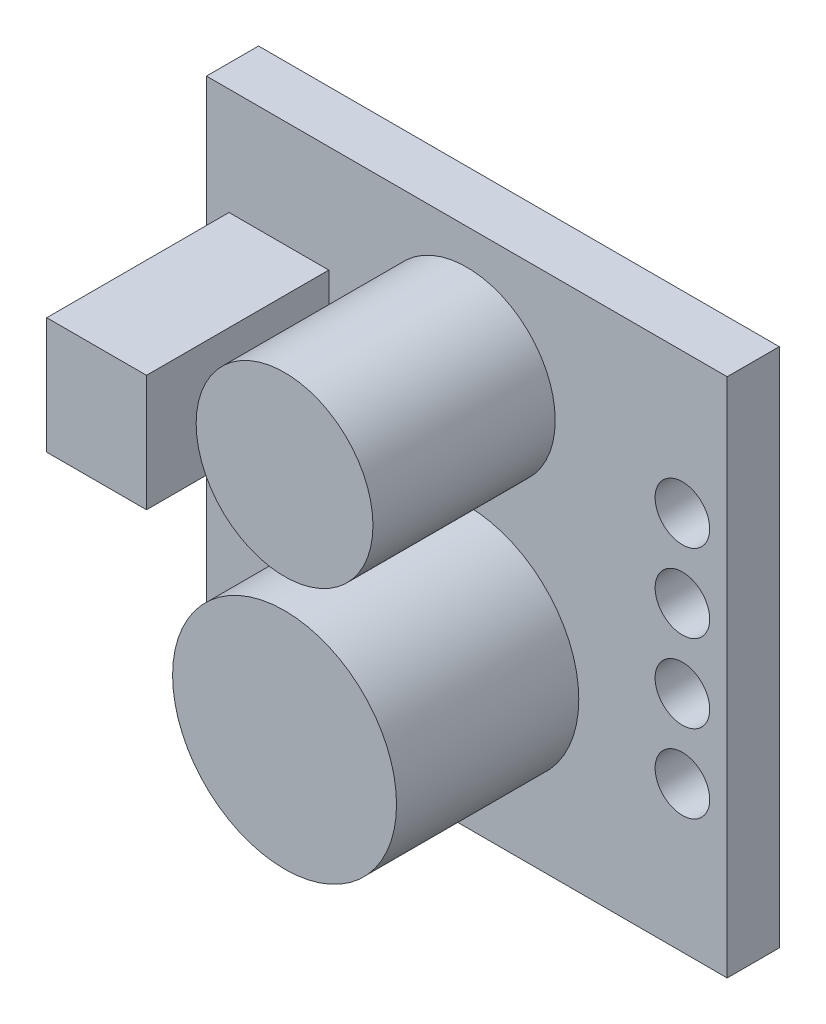
ISO-10303-21;
HEADER;
FILE_DESCRIPTION(('STEP AP214'),'2;1');
FILE_NAME('part.step','',(''),(''),'','','');
FILE_SCHEMA(('AUTOMOTIVE_DESIGN { 1 0 10303 214 1 1 1 1 }'));
ENDSEC;
DATA;
#1=APPLICATION_CONTEXT('core data for automotive mechanical design processes');
#2=APPLICATION_PROTOCOL_DEFINITION('international standard','automotive_design',2000,#1);
#3=PRODUCT_CONTEXT('',#1,'mechanical');
#4=PRODUCT('Part','Part','',(#3));
#5=PRODUCT_RELATED_PRODUCT_CATEGORY('part','',(#4));
#6=PRODUCT_DEFINITION_FORMATION('','',#4);
#7=PRODUCT_DEFINITION_CONTEXT('part definition',#1,'design');
#8=PRODUCT_DEFINITION('design','',#6,#7);
#9=PRODUCT_DEFINITION_SHAPE('','',#8);
#10=(LENGTH_UNIT() NAMED_UNIT(*) SI_UNIT(.MILLI.,.METRE.));
#11=(NAMED_UNIT(*) PLANE_ANGLE_UNIT() SI_UNIT($,.RADIAN.));
#12=(NAMED_UNIT(*) SI_UNIT($,.STERADIAN.) SOLID_ANGLE_UNIT());
#13=UNCERTAINTY_MEASURE_WITH_UNIT(LENGTH_MEASURE(1.E-05),#10,'distance_accuracy_value','');
#14=(GEOMETRIC_REPRESENTATION_CONTEXT(3) GLOBAL_UNCERTAINTY_ASSIGNED_CONTEXT((#13)) GLOBAL_UNIT_ASSIGNED_CONTEXT((#10,
#11,#12)) REPRESENTATION_CONTEXT('',''));
#15=CARTESIAN_POINT('',(0.,0.,0.));
#16=DIRECTION('',(0.,0.,1.));
#17=DIRECTION('',(1.,0.,0.));
#18=AXIS2_PLACEMENT_3D('',#15,#16,#17);
#19=CARTESIAN_POINT('',(0.,0.,2.));
#20=DIRECTION('',(0.,0.,-1.));
#21=DIRECTION('',(-1.,0.,0.));
#22=AXIS2_PLACEMENT_3D('',#19,#20,#21);
#23=PLANE('',#22);
#24=CARTESIAN_POINT('',(8.28012745863704,4.59800209335981,2.));
#25=DIRECTION('',(0.,0.,1.));
#26=DIRECTION('',(1.,0.,0.));
#27=AXIS2_PLACEMENT_3D('',#24,#25,#26);
#28=CIRCLE('',#27,1.04892016649654);
#29=CARTESIAN_POINT('',(9.32904762513358,4.59800209335981,2.));
#30=VERTEX_POINT('',#29);
#31=EDGE_CURVE('E202',#30,#30,#28,.T.);
#32=ORIENTED_EDGE('',*,*,#31,.F.);
#33=EDGE_LOOP('',(#32));
#34=FACE_BOUND('',#33,.T.);
#35=CARTESIAN_POINT('',(8.28012745863708,1.59800209335981,2.));
#36=DIRECTION('',(0.,0.,1.));
#37=DIRECTION('',(1.,0.,0.));
#38=AXIS2_PLACEMENT_3D('',#35,#36,#37);
#39=CIRCLE('',#38,1.04892016649654);
#40=CARTESIAN_POINT('',(9.32904762513361,1.59800209335981,2.));
#41=VERTEX_POINT('',#40);
#42=EDGE_CURVE('E196',#41,#41,#39,.T.);
#43=ORIENTED_EDGE('',*,*,#42,.F.);
#44=EDGE_LOOP('',(#43));
#45=FACE_BOUND('',#44,.T.);
#46=CARTESIAN_POINT('',(8.28012745863711,-1.40199790664019,2.));
#47=DIRECTION('',(0.,0.,1.));
#48=DIRECTION('',(1.,0.,0.));
#49=AXIS2_PLACEMENT_3D('',#46,#47,#48);
#50=CIRCLE('',#49,1.04892016649654);
#51=CARTESIAN_POINT('',(9.32904762513364,-1.40199790664019,2.));
#52=VERTEX_POINT('',#51);
#53=EDGE_CURVE('E190',#52,#52,#50,.T.);
#54=ORIENTED_EDGE('',*,*,#53,.F.);
#55=EDGE_LOOP('',(#54));
#56=FACE_BOUND('',#55,.T.);
#57=CARTESIAN_POINT('',(8.28012745863714,-4.40199790664019,2.));
#58=DIRECTION('',(0.,0.,1.));
#59=DIRECTION('',(1.,0.,0.));
#60=AXIS2_PLACEMENT_3D('',#57,#58,#59);
#61=CIRCLE('',#60,1.04892016649654);
#62=CARTESIAN_POINT('',(9.32904762513367,-4.40199790664019,2.));
#63=VERTEX_POINT('',#62);
#64=EDGE_CURVE('E184',#63,#63,#61,.T.);
#65=ORIENTED_EDGE('',*,*,#64,.F.);
#66=EDGE_LOOP('',(#65));
#67=FACE_BOUND('',#66,.T.);
#68=DIRECTION('',(0.,1.,0.));
#69=VECTOR('',#68,1.);
#70=CARTESIAN_POINT('',(10.,-10.,2.));
#71=LINE('',#70,#69);
#72=CARTESIAN_POINT('',(10.,-10.,2.));
#73=VERTEX_POINT('',#72);
#74=CARTESIAN_POINT('',(10.,10.,2.));
#75=VERTEX_POINT('',#74);
#76=EDGE_CURVE('E131',#73,#75,#71,.T.);
#77=ORIENTED_EDGE('',*,*,#76,.T.);
#78=DIRECTION('',(-1.,0.,0.));
#79=VECTOR('',#78,1.);
#80=CARTESIAN_POINT('',(-10.,10.,2.));
#81=LINE('',#80,#79);
#82=CARTESIAN_POINT('',(-10.,10.,2.));
#83=VERTEX_POINT('',#82);
#84=EDGE_CURVE('E134',#75,#83,#81,.T.);
#85=ORIENTED_EDGE('',*,*,#84,.T.);
#86=DIRECTION('',(0.,-1.,0.));
#87=VECTOR('',#86,1.);
#88=CARTESIAN_POINT('',(-10.,-10.,2.));
#89=LINE('',#88,#87);
#90=CARTESIAN_POINT('',(-10.,-10.,2.));
#91=VERTEX_POINT('',#90);
#92=EDGE_CURVE('E137',#83,#91,#89,.T.);
#93=ORIENTED_EDGE('',*,*,#92,.T.);
#94=DIRECTION('',(1.,0.,0.));
#95=VECTOR('',#94,1.);
#96=CARTESIAN_POINT('',(-10.,-10.,2.));
#97=LINE('',#96,#95);
#98=EDGE_CURVE('E139',#91,#73,#97,.T.);
#99=ORIENTED_EDGE('',*,*,#98,.T.);
#100=EDGE_LOOP('',(#77,#85,#93,#99));
#101=FACE_BOUND('',#100,.T.);
#102=CARTESIAN_POINT('',(0.,5.24700562003488,2.));
#103=DIRECTION('',(0.,0.,-1.));
#104=DIRECTION('',(-1.,0.,0.));
#105=AXIS2_PLACEMENT_3D('',#102,#103,#104);
#106=CIRCLE('',#105,3.39530296874813);
#107=CARTESIAN_POINT('',(-3.39530296874813,5.24700562003488,2.));
#108=VERTEX_POINT('',#107);
#109=EDGE_CURVE('E41',#108,#108,#106,.F.);
#110=ORIENTED_EDGE('',*,*,#109,.F.);
#111=EDGE_LOOP('',(#110));
#112=FACE_BOUND('',#111,.T.);
#113=CARTESIAN_POINT('',(0.,-3.57798898691897,2.));
#114=DIRECTION('',(0.,0.,-1.));
#115=DIRECTION('',(-1.,0.,0.));
#116=AXIS2_PLACEMENT_3D('',#113,#114,#115);
#117=CIRCLE('',#116,4.30062691817861);
#118=CARTESIAN_POINT('',(-4.30062691817861,-3.57798898691897,2.));
#119=VERTEX_POINT('',#118);
#120=EDGE_CURVE('E11',#119,#119,#117,.F.);
#121=ORIENTED_EDGE('',*,*,#120,.F.);
#122=EDGE_LOOP('',(#121));
#123=FACE_BOUND('',#122,.T.);
#124=DIRECTION('',(0.,1.,0.));
#125=VECTOR('',#124,1.);
#126=CARTESIAN_POINT('',(-5.30183976980148,1.42174782703819,2.));
#127=LINE('',#126,#125);
#128=CARTESIAN_POINT('',(-5.30183976980148,1.42174782703819,2.));
#129=VERTEX_POINT('',#128);
#130=CARTESIAN_POINT('',(-5.30183976980148,5.89586116117857,2.));
#131=VERTEX_POINT('',#130);
#132=EDGE_CURVE('E118',#129,#131,#127,.T.);
#133=ORIENTED_EDGE('',*,*,#132,.F.);
#134=DIRECTION('',(1.,0.,0.));
#135=VECTOR('',#134,1.);
#136=CARTESIAN_POINT('',(-9.13389711942081,1.42174782703819,2.));
#137=LINE('',#136,#135);
#138=CARTESIAN_POINT('',(-9.13389711942081,1.42174782703819,2.));
#139=VERTEX_POINT('',#138);
#140=EDGE_CURVE('E115',#139,#129,#137,.T.);
#141=ORIENTED_EDGE('',*,*,#140,.F.);
#142=DIRECTION('',(0.,-1.,0.));
#143=VECTOR('',#142,1.);
#144=CARTESIAN_POINT('',(-9.13389711942081,1.42174782703819,2.));
#145=LINE('',#144,#143);
#146=CARTESIAN_POINT('',(-9.13389711942081,5.89586116117857,2.));
#147=VERTEX_POINT('',#146);
#148=EDGE_CURVE('E53',#147,#139,#145,.T.);
#149=ORIENTED_EDGE('',*,*,#148,.F.);
#150=DIRECTION('',(-1.,0.,0.));
#151=VECTOR('',#150,1.);
#152=CARTESIAN_POINT('',(-9.13389711942081,5.89586116117857,2.));
#153=LINE('',#152,#151);
#154=EDGE_CURVE('E48',#131,#147,#153,.T.);
#155=ORIENTED_EDGE('',*,*,#154,.F.);
#156=EDGE_LOOP('',(#133,#141,#149,#155));
#157=FACE_BOUND('',#156,.T.);
#158=ADVANCED_FACE('F33',(#34,#45,#56,#67,#101,#112,#123,#157),#23,.F.);
#159=CARTESIAN_POINT('',(10.,-10.,2.));
#160=DIRECTION('',(-1.,0.,0.));
#161=DIRECTION('',(0.,0.,1.));
#162=AXIS2_PLACEMENT_3D('',#159,#160,#161);
#163=PLANE('',#162);
#164=DIRECTION('',(0.,1.,0.));
#165=VECTOR('',#164,1.);
#166=CARTESIAN_POINT('',(10.,-10.,0.));
#167=LINE('',#166,#165);
#168=CARTESIAN_POINT('',(10.,-10.,0.));
#169=VERTEX_POINT('',#168);
#170=CARTESIAN_POINT('',(10.,10.,0.));
#171=VERTEX_POINT('',#170);
#172=EDGE_CURVE('E130',#169,#171,#167,.T.);
#173=ORIENTED_EDGE('',*,*,#172,.T.);
#174=DIRECTION('',(0.,0.,-1.));
#175=VECTOR('',#174,1.);
#176=CARTESIAN_POINT('',(10.,10.,2.));
#177=LINE('',#176,#175);
#178=EDGE_CURVE('E157',#75,#171,#177,.T.);
#179=ORIENTED_EDGE('',*,*,#178,.F.);
#180=ORIENTED_EDGE('',*,*,#76,.F.);
#181=DIRECTION('',(0.,0.,-1.));
#182=VECTOR('',#181,1.);
#183=CARTESIAN_POINT('',(10.,-10.,2.));
#184=LINE('',#183,#182);
#185=EDGE_CURVE('E141',#73,#169,#184,.T.);
#186=ORIENTED_EDGE('',*,*,#185,.T.);
#187=EDGE_LOOP('',(#173,#179,#180,#186));
#188=FACE_BOUND('',#187,.T.);
#189=ADVANCED_FACE('F35',(#188),#163,.F.);
#190=CARTESIAN_POINT('',(-10.,10.,2.));
#191=DIRECTION('',(0.,-1.,0.));
#192=DIRECTION('',(0.,0.,-1.));
#193=AXIS2_PLACEMENT_3D('',#190,#191,#192);
#194=PLANE('',#193);
#195=DIRECTION('',(-1.,0.,0.));
#196=VECTOR('',#195,1.);
#197=CARTESIAN_POINT('',(-10.,10.,0.));
#198=LINE('',#197,#196);
#199=CARTESIAN_POINT('',(-10.,10.,0.));
#200=VERTEX_POINT('',#199);
#201=EDGE_CURVE('E144',#171,#200,#198,.T.);
#202=ORIENTED_EDGE('',*,*,#201,.T.);
#203=DIRECTION('',(0.,0.,-1.));
#204=VECTOR('',#203,1.);
#205=CARTESIAN_POINT('',(-10.,10.,2.));
#206=LINE('',#205,#204);
#207=EDGE_CURVE('E154',#83,#200,#206,.T.);
#208=ORIENTED_EDGE('',*,*,#207,.F.);
#209=ORIENTED_EDGE('',*,*,#84,.F.);
#210=ORIENTED_EDGE('',*,*,#178,.T.);
#211=EDGE_LOOP('',(#202,#208,#209,#210));
#212=FACE_BOUND('',#211,.T.);
#213=ADVANCED_FACE('F232',(#212),#194,.F.);
#214=CARTESIAN_POINT('',(-10.,-10.,2.));
#215=DIRECTION('',(1.,0.,0.));
#216=DIRECTION('',(0.,0.,-1.));
#217=AXIS2_PLACEMENT_3D('',#214,#215,#216);
#218=PLANE('',#217);
#219=DIRECTION('',(0.,-1.,0.));
#220=VECTOR('',#219,1.);
#221=CARTESIAN_POINT('',(-10.,-10.,0.));
#222=LINE('',#221,#220);
#223=CARTESIAN_POINT('',(-10.,-10.,0.));
#224=VERTEX_POINT('',#223);
#225=EDGE_CURVE('E146',#200,#224,#222,.T.);
#226=ORIENTED_EDGE('',*,*,#225,.T.);
#227=DIRECTION('',(0.,0.,-1.));
#228=VECTOR('',#227,1.);
#229=CARTESIAN_POINT('',(-10.,-10.,2.));
#230=LINE('',#229,#228);
#231=EDGE_CURVE('E151',#91,#224,#230,.T.);
#232=ORIENTED_EDGE('',*,*,#231,.F.);
#233=ORIENTED_EDGE('',*,*,#92,.F.);
#234=ORIENTED_EDGE('',*,*,#207,.T.);
#235=EDGE_LOOP('',(#226,#232,#233,#234));
#236=FACE_BOUND('',#235,.T.);
#237=ADVANCED_FACE('F237',(#236),#218,.F.);
#238=CARTESIAN_POINT('',(-10.,-10.,2.));
#239=DIRECTION('',(0.,1.,0.));
#240=DIRECTION('',(0.,0.,1.));
#241=AXIS2_PLACEMENT_3D('',#238,#239,#240);
#242=PLANE('',#241);
#243=DIRECTION('',(1.,0.,0.));
#244=VECTOR('',#243,1.);
#245=CARTESIAN_POINT('',(-10.,-10.,0.));
#246=LINE('',#245,#244);
#247=EDGE_CURVE('E135',#224,#169,#246,.T.);
#248=ORIENTED_EDGE('',*,*,#247,.T.);
#249=ORIENTED_EDGE('',*,*,#185,.F.);
#250=ORIENTED_EDGE('',*,*,#98,.F.);
#251=ORIENTED_EDGE('',*,*,#231,.T.);
#252=EDGE_LOOP('',(#248,#249,#250,#251));
#253=FACE_BOUND('',#252,.T.);
#254=ADVANCED_FACE('F240',(#253),#242,.F.);
#255=CARTESIAN_POINT('',(0.,0.,0.));
#256=DIRECTION('',(0.,0.,-1.));
#257=DIRECTION('',(-1.,0.,0.));
#258=AXIS2_PLACEMENT_3D('',#255,#256,#257);
#259=PLANE('',#258);
#260=CARTESIAN_POINT('',(8.28012745863704,4.59800209335981,0.));
#261=DIRECTION('',(0.,0.,1.));
#262=DIRECTION('',(1.,0.,0.));
#263=AXIS2_PLACEMENT_3D('',#260,#261,#262);
#264=CIRCLE('',#263,1.04892016649654);
#265=CARTESIAN_POINT('',(9.32904762513358,4.59800209335981,0.));
#266=VERTEX_POINT('',#265);
#267=EDGE_CURVE('E170',#266,#266,#264,.T.);
#268=ORIENTED_EDGE('',*,*,#267,.T.);
#269=EDGE_LOOP('',(#268));
#270=FACE_BOUND('',#269,.T.);
#271=CARTESIAN_POINT('',(8.28012745863708,1.59800209335981,0.));
#272=DIRECTION('',(0.,0.,1.));
#273=DIRECTION('',(1.,0.,0.));
#274=AXIS2_PLACEMENT_3D('',#271,#272,#273);
#275=CIRCLE('',#274,1.04892016649654);
#276=CARTESIAN_POINT('',(9.32904762513361,1.59800209335981,0.));
#277=VERTEX_POINT('',#276);
#278=EDGE_CURVE('E199',#277,#277,#275,.T.);
#279=ORIENTED_EDGE('',*,*,#278,.T.);
#280=EDGE_LOOP('',(#279));
#281=FACE_BOUND('',#280,.T.);
#282=CARTESIAN_POINT('',(8.28012745863711,-1.40199790664019,0.));
#283=DIRECTION('',(0.,0.,1.));
#284=DIRECTION('',(1.,0.,0.));
#285=AXIS2_PLACEMENT_3D('',#282,#283,#284);
#286=CIRCLE('',#285,1.04892016649654);
#287=CARTESIAN_POINT('',(9.32904762513364,-1.40199790664019,0.));
#288=VERTEX_POINT('',#287);
#289=EDGE_CURVE('E193',#288,#288,#286,.T.);
#290=ORIENTED_EDGE('',*,*,#289,.T.);
#291=EDGE_LOOP('',(#290));
#292=FACE_BOUND('',#291,.T.);
#293=CARTESIAN_POINT('',(8.28012745863714,-4.40199790664019,0.));
#294=DIRECTION('',(0.,0.,1.));
#295=DIRECTION('',(1.,0.,0.));
#296=AXIS2_PLACEMENT_3D('',#293,#294,#295);
#297=CIRCLE('',#296,1.04892016649654);
#298=CARTESIAN_POINT('',(9.32904762513367,-4.40199790664019,0.));
#299=VERTEX_POINT('',#298);
#300=EDGE_CURVE('E187',#299,#299,#297,.T.);
#301=ORIENTED_EDGE('',*,*,#300,.T.);
#302=EDGE_LOOP('',(#301));
#303=FACE_BOUND('',#302,.T.);
#304=ORIENTED_EDGE('',*,*,#172,.F.);
#305=ORIENTED_EDGE('',*,*,#247,.F.);
#306=ORIENTED_EDGE('',*,*,#225,.F.);
#307=ORIENTED_EDGE('',*,*,#201,.F.);
#308=EDGE_LOOP('',(#304,#305,#306,#307));
#309=FACE_BOUND('',#308,.T.);
#310=ADVANCED_FACE('F208',(#270,#281,#292,#303,#309),#259,.T.);
#311=CARTESIAN_POINT('',(0.,5.24700562003488,9.));
#312=DIRECTION('',(0.,0.,-1.));
#313=DIRECTION('',(-1.,0.,0.));
#314=AXIS2_PLACEMENT_3D('',#311,#312,#313);
#315=CYLINDRICAL_SURFACE('',#314,3.39530296874813);
#316=CARTESIAN_POINT('',(0.,5.24700562003488,9.));
#317=DIRECTION('',(0.,0.,1.));
#318=DIRECTION('',(1.,0.,0.));
#319=AXIS2_PLACEMENT_3D('',#316,#317,#318);
#320=CIRCLE('',#319,3.39530296874813);
#321=CARTESIAN_POINT('',(3.39530296874813,5.24700562003488,9.));
#322=VERTEX_POINT('',#321);
#323=EDGE_CURVE('E122',#322,#322,#320,.T.);
#324=ORIENTED_EDGE('',*,*,#323,.F.);
#325=EDGE_LOOP('',(#324));
#326=FACE_BOUND('',#325,.T.);
#327=ORIENTED_EDGE('',*,*,#109,.T.);
#328=EDGE_LOOP('',(#327));
#329=FACE_BOUND('',#328,.T.);
#330=ADVANCED_FACE('F162',(#326,#329),#315,.T.);
#331=CARTESIAN_POINT('',(0.,5.24700562003488,9.));
#332=DIRECTION('',(0.,0.,1.));
#333=DIRECTION('',(1.,0.,0.));
#334=AXIS2_PLACEMENT_3D('',#331,#332,#333);
#335=PLANE('',#334);
#336=ORIENTED_EDGE('',*,*,#323,.T.);
#337=EDGE_LOOP('',(#336));
#338=FACE_BOUND('',#337,.T.);
#339=ADVANCED_FACE('F248',(#338),#335,.T.);
#340=CARTESIAN_POINT('',(0.,-3.57798898691897,9.));
#341=DIRECTION('',(0.,0.,-1.));
#342=DIRECTION('',(-1.,0.,0.));
#343=AXIS2_PLACEMENT_3D('',#340,#341,#342);
#344=CYLINDRICAL_SURFACE('',#343,4.30062691817861);
#345=CARTESIAN_POINT('',(0.,-3.57798898691897,9.));
#346=DIRECTION('',(0.,0.,1.));
#347=DIRECTION('',(1.,0.,0.));
#348=AXIS2_PLACEMENT_3D('',#345,#346,#347);
#349=CIRCLE('',#348,4.30062691817861);
#350=CARTESIAN_POINT('',(4.30062691817861,-3.57798898691897,9.));
#351=VERTEX_POINT('',#350);
#352=EDGE_CURVE('E119',#351,#351,#349,.T.);
#353=ORIENTED_EDGE('',*,*,#352,.F.);
#354=EDGE_LOOP('',(#353));
#355=FACE_BOUND('',#354,.T.);
#356=ORIENTED_EDGE('',*,*,#120,.T.);
#357=EDGE_LOOP('',(#356));
#358=FACE_BOUND('',#357,.T.);
#359=ADVANCED_FACE('F331',(#355,#358),#344,.T.);
#360=CARTESIAN_POINT('',(0.,-3.57798898691897,9.));
#361=DIRECTION('',(0.,0.,1.));
#362=DIRECTION('',(1.,0.,0.));
#363=AXIS2_PLACEMENT_3D('',#360,#361,#362);
#364=PLANE('',#363);
#365=ORIENTED_EDGE('',*,*,#352,.T.);
#366=EDGE_LOOP('',(#365));
#367=FACE_BOUND('',#366,.T.);
#368=ADVANCED_FACE('F328',(#367),#364,.T.);
#369=CARTESIAN_POINT('',(-5.30183976980148,1.42174782703819,9.));
#370=DIRECTION('',(-1.,0.,0.));
#371=DIRECTION('',(0.,0.,1.));
#372=AXIS2_PLACEMENT_3D('',#369,#370,#371);
#373=PLANE('',#372);
#374=ORIENTED_EDGE('',*,*,#132,.T.);
#375=DIRECTION('',(0.,0.,-1.));
#376=VECTOR('',#375,1.);
#377=CARTESIAN_POINT('',(-5.30183976980148,5.89586116117857,9.));
#378=LINE('',#377,#376);
#379=CARTESIAN_POINT('',(-5.30183976980148,5.89586116117857,9.));
#380=VERTEX_POINT('',#379);
#381=EDGE_CURVE('E99',#380,#131,#378,.T.);
#382=ORIENTED_EDGE('',*,*,#381,.F.);
#383=DIRECTION('',(0.,1.,0.));
#384=VECTOR('',#383,1.);
#385=CARTESIAN_POINT('',(-5.30183976980148,1.42174782703819,9.));
#386=LINE('',#385,#384);
#387=CARTESIAN_POINT('',(-5.30183976980148,1.42174782703819,9.));
#388=VERTEX_POINT('',#387);
#389=EDGE_CURVE('E106',#388,#380,#386,.T.);
#390=ORIENTED_EDGE('',*,*,#389,.F.);
#391=DIRECTION('',(0.,0.,-1.));
#392=VECTOR('',#391,1.);
#393=CARTESIAN_POINT('',(-5.30183976980148,1.42174782703819,9.));
#394=LINE('',#393,#392);
#395=EDGE_CURVE('E175',#388,#129,#394,.T.);
#396=ORIENTED_EDGE('',*,*,#395,.T.);
#397=EDGE_LOOP('',(#374,#382,#390,#396));
#398=FACE_BOUND('',#397,.T.);
#399=ADVANCED_FACE('F117',(#398),#373,.F.);
#400=CARTESIAN_POINT('',(-9.13389711942081,5.89586116117857,9.));
#401=DIRECTION('',(0.,-1.,0.));
#402=DIRECTION('',(0.,0.,-1.));
#403=AXIS2_PLACEMENT_3D('',#400,#401,#402);
#404=PLANE('',#403);
#405=ORIENTED_EDGE('',*,*,#154,.T.);
#406=DIRECTION('',(0.,0.,-1.));
#407=VECTOR('',#406,1.);
#408=CARTESIAN_POINT('',(-9.13389711942081,5.89586116117857,9.));
#409=LINE('',#408,#407);
#410=CARTESIAN_POINT('',(-9.13389711942081,5.89586116117857,9.));
#411=VERTEX_POINT('',#410);
#412=EDGE_CURVE('E102',#411,#147,#409,.T.);
#413=ORIENTED_EDGE('',*,*,#412,.F.);
#414=DIRECTION('',(-1.,0.,0.));
#415=VECTOR('',#414,1.);
#416=CARTESIAN_POINT('',(-9.13389711942081,5.89586116117857,9.));
#417=LINE('',#416,#415);
#418=EDGE_CURVE('E95',#380,#411,#417,.T.);
#419=ORIENTED_EDGE('',*,*,#418,.F.);
#420=ORIENTED_EDGE('',*,*,#381,.T.);
#421=EDGE_LOOP('',(#405,#413,#419,#420));
#422=FACE_BOUND('',#421,.T.);
#423=ADVANCED_FACE('F97',(#422),#404,.F.);
#424=CARTESIAN_POINT('',(-9.13389711942081,1.42174782703819,9.));
#425=DIRECTION('',(1.,0.,0.));
#426=DIRECTION('',(0.,0.,-1.));
#427=AXIS2_PLACEMENT_3D('',#424,#425,#426);
#428=PLANE('',#427);
#429=ORIENTED_EDGE('',*,*,#148,.T.);
#430=DIRECTION('',(0.,0.,-1.));
#431=VECTOR('',#430,1.);
#432=CARTESIAN_POINT('',(-9.13389711942081,1.42174782703819,9.));
#433=LINE('',#432,#431);
#434=CARTESIAN_POINT('',(-9.13389711942081,1.42174782703819,9.));
#435=VERTEX_POINT('',#434);
#436=EDGE_CURVE('E124',#435,#139,#433,.T.);
#437=ORIENTED_EDGE('',*,*,#436,.F.);
#438=DIRECTION('',(0.,-1.,0.));
#439=VECTOR('',#438,1.);
#440=CARTESIAN_POINT('',(-9.13389711942081,1.42174782703819,9.));
#441=LINE('',#440,#439);
#442=EDGE_CURVE('E105',#411,#435,#441,.T.);
#443=ORIENTED_EDGE('',*,*,#442,.F.);
#444=ORIENTED_EDGE('',*,*,#412,.T.);
#445=EDGE_LOOP('',(#429,#437,#443,#444));
#446=FACE_BOUND('',#445,.T.);
#447=ADVANCED_FACE('F320',(#446),#428,.F.);
#448=CARTESIAN_POINT('',(-9.13389711942081,1.42174782703819,9.));
#449=DIRECTION('',(0.,1.,0.));
#450=DIRECTION('',(0.,0.,1.));
#451=AXIS2_PLACEMENT_3D('',#448,#449,#450);
#452=PLANE('',#451);
#453=ORIENTED_EDGE('',*,*,#140,.T.);
#454=ORIENTED_EDGE('',*,*,#395,.F.);
#455=DIRECTION('',(1.,0.,0.));
#456=VECTOR('',#455,1.);
#457=CARTESIAN_POINT('',(-9.13389711942081,1.42174782703819,9.));
#458=LINE('',#457,#456);
#459=EDGE_CURVE('E111',#435,#388,#458,.T.);
#460=ORIENTED_EDGE('',*,*,#459,.F.);
#461=ORIENTED_EDGE('',*,*,#436,.T.);
#462=EDGE_LOOP('',(#453,#454,#460,#461));
#463=FACE_BOUND('',#462,.T.);
#464=ADVANCED_FACE('F174',(#463),#452,.F.);
#465=CARTESIAN_POINT('',(0.,0.,9.));
#466=DIRECTION('',(0.,0.,-1.));
#467=DIRECTION('',(-1.,0.,0.));
#468=AXIS2_PLACEMENT_3D('',#465,#466,#467);
#469=PLANE('',#468);
#470=ORIENTED_EDGE('',*,*,#389,.T.);
#471=ORIENTED_EDGE('',*,*,#418,.T.);
#472=ORIENTED_EDGE('',*,*,#442,.T.);
#473=ORIENTED_EDGE('',*,*,#459,.T.);
#474=EDGE_LOOP('',(#470,#471,#472,#473));
#475=FACE_BOUND('',#474,.T.);
#476=ADVANCED_FACE('F109',(#475),#469,.F.);
#477=CARTESIAN_POINT('',(8.28012745863714,-4.40199790664019,0.));
#478=DIRECTION('',(0.,0.,1.));
#479=DIRECTION('',(1.,0.,0.));
#480=AXIS2_PLACEMENT_3D('',#477,#478,#479);
#481=CYLINDRICAL_SURFACE('',#480,1.04892016649654);
#482=ORIENTED_EDGE('',*,*,#300,.F.);
#483=EDGE_LOOP('',(#482));
#484=FACE_BOUND('',#483,.T.);
#485=ORIENTED_EDGE('',*,*,#64,.T.);
#486=EDGE_LOOP('',(#485));
#487=FACE_BOUND('',#486,.T.);
#488=ADVANCED_FACE('F280',(#484,#487),#481,.F.);
#489=CARTESIAN_POINT('',(8.28012745863711,-1.40199790664019,0.));
#490=DIRECTION('',(0.,0.,1.));
#491=DIRECTION('',(1.,0.,0.));
#492=AXIS2_PLACEMENT_3D('',#489,#490,#491);
#493=CYLINDRICAL_SURFACE('',#492,1.04892016649654);
#494=ORIENTED_EDGE('',*,*,#289,.F.);
#495=EDGE_LOOP('',(#494));
#496=FACE_BOUND('',#495,.T.);
#497=ORIENTED_EDGE('',*,*,#53,.T.);
#498=EDGE_LOOP('',(#497));
#499=FACE_BOUND('',#498,.T.);
#500=ADVANCED_FACE('F285',(#496,#499),#493,.F.);
#501=CARTESIAN_POINT('',(8.28012745863708,1.59800209335981,0.));
#502=DIRECTION('',(0.,0.,1.));
#503=DIRECTION('',(1.,0.,0.));
#504=AXIS2_PLACEMENT_3D('',#501,#502,#503);
#505=CYLINDRICAL_SURFACE('',#504,1.04892016649654);
#506=ORIENTED_EDGE('',*,*,#278,.F.);
#507=EDGE_LOOP('',(#506));
#508=FACE_BOUND('',#507,.T.);
#509=ORIENTED_EDGE('',*,*,#42,.T.);
#510=EDGE_LOOP('',(#509));
#511=FACE_BOUND('',#510,.T.);
#512=ADVANCED_FACE('F214',(#508,#511),#505,.F.);
#513=CARTESIAN_POINT('',(8.28012745863704,4.59800209335981,0.));
#514=DIRECTION('',(0.,0.,1.));
#515=DIRECTION('',(1.,0.,0.));
#516=AXIS2_PLACEMENT_3D('',#513,#514,#515);
#517=CYLINDRICAL_SURFACE('',#516,1.04892016649654);
#518=ORIENTED_EDGE('',*,*,#267,.F.);
#519=EDGE_LOOP('',(#518));
#520=FACE_BOUND('',#519,.T.);
#521=ORIENTED_EDGE('',*,*,#31,.T.);
#522=EDGE_LOOP('',(#521));
#523=FACE_BOUND('',#522,.T.);
#524=ADVANCED_FACE('F211',(#520,#523),#517,.F.);
#525=CLOSED_SHELL('',(#158,#189,#213,#237,#254,#310,#330,#339,#359,#368,#399,#423,#447,#464,
#476,#488,#500,#512,#524));
#526=MANIFOLD_SOLID_BREP('B2',#525);
#527=ADVANCED_BREP_SHAPE_REPRESENTATION('',(#18,#526),#14);
#528=SHAPE_DEFINITION_REPRESENTATION(#9,#527);
ENDSEC;
END-ISO-10303-21;
